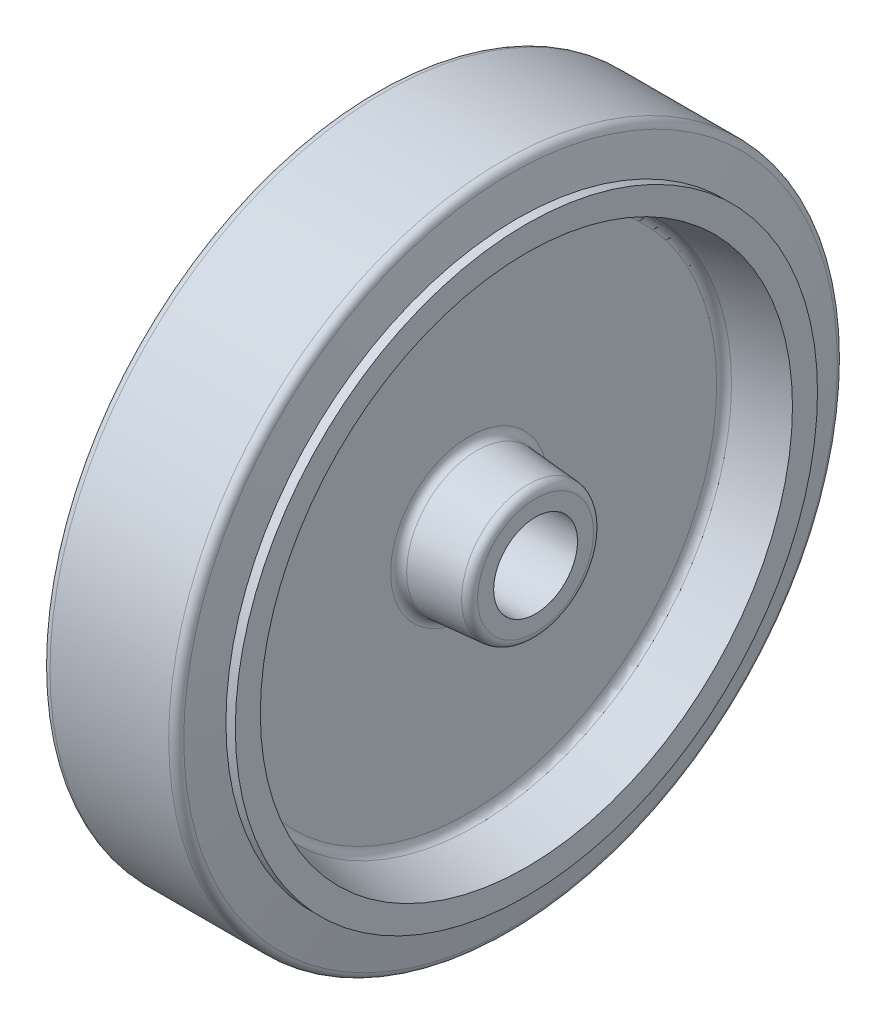
ISO-10303-21;
HEADER;
FILE_DESCRIPTION(('STEP AP214'),'2;1');
FILE_NAME('part.step','',(''),(''),'','','');
FILE_SCHEMA(('AUTOMOTIVE_DESIGN { 1 0 10303 214 1 1 1 1 }'));
ENDSEC;
DATA;
#1=APPLICATION_CONTEXT('core data for automotive mechanical design processes');
#2=APPLICATION_PROTOCOL_DEFINITION('international standard','automotive_design',2000,#1);
#3=PRODUCT_CONTEXT('',#1,'mechanical');
#4=PRODUCT('Part','Part','',(#3));
#5=PRODUCT_RELATED_PRODUCT_CATEGORY('part','',(#4));
#6=PRODUCT_DEFINITION_FORMATION('','',#4);
#7=PRODUCT_DEFINITION_CONTEXT('part definition',#1,'design');
#8=PRODUCT_DEFINITION('design','',#6,#7);
#9=PRODUCT_DEFINITION_SHAPE('','',#8);
#10=(LENGTH_UNIT() NAMED_UNIT(*) SI_UNIT(.MILLI.,.METRE.));
#11=(NAMED_UNIT(*) PLANE_ANGLE_UNIT() SI_UNIT($,.RADIAN.));
#12=(NAMED_UNIT(*) SI_UNIT($,.STERADIAN.) SOLID_ANGLE_UNIT());
#13=UNCERTAINTY_MEASURE_WITH_UNIT(LENGTH_MEASURE(1.E-05),#10,'distance_accuracy_value','');
#14=(GEOMETRIC_REPRESENTATION_CONTEXT(3) GLOBAL_UNCERTAINTY_ASSIGNED_CONTEXT((#13)) GLOBAL_UNIT_ASSIGNED_CONTEXT((#10,
#11,#12)) REPRESENTATION_CONTEXT('',''));
#15=CARTESIAN_POINT('',(0.,0.,0.));
#16=DIRECTION('',(0.,0.,1.));
#17=DIRECTION('',(1.,0.,0.));
#18=AXIS2_PLACEMENT_3D('',#15,#16,#17);
#19=CARTESIAN_POINT('',(15.9,0.,0.));
#20=DIRECTION('',(-1.,0.,0.));
#21=DIRECTION('',(0.,0.,1.));
#22=AXIS2_PLACEMENT_3D('',#19,#20,#21);
#23=CONICAL_SURFACE('',#22,80.,1.39137423336047);
#24=CARTESIAN_POINT('',(16.1980092545903,0.,0.));
#25=DIRECTION('',(1.,0.,0.));
#26=DIRECTION('',(0.,0.,-1.));
#27=AXIS2_PLACEMENT_3D('',#24,#25,#26);
#28=CIRCLE('',#27,78.3569219476642);
#29=CARTESIAN_POINT('',(16.1980092545903,0.,-78.3569219476642));
#30=VERTEX_POINT('',#29);
#31=EDGE_CURVE('E48',#30,#30,#28,.T.);
#32=ORIENTED_EDGE('',*,*,#31,.T.);
#33=EDGE_LOOP('',(#32));
#34=FACE_BOUND('',#33,.T.);
#35=CARTESIAN_POINT('',(17.75,0.,0.));
#36=DIRECTION('',(-1.,0.,0.));
#37=DIRECTION('',(0.,0.,1.));
#38=AXIS2_PLACEMENT_3D('',#35,#36,#37);
#39=CIRCLE('',#38,69.8);
#40=CARTESIAN_POINT('',(17.75,0.,69.8));
#41=VERTEX_POINT('',#40);
#42=EDGE_CURVE('E93',#41,#41,#39,.T.);
#43=ORIENTED_EDGE('',*,*,#42,.T.);
#44=EDGE_LOOP('',(#43));
#45=FACE_BOUND('',#44,.T.);
#46=ADVANCED_FACE('F37',(#34,#45),#23,.T.);
#47=CARTESIAN_POINT('',(0.,0.,0.));
#48=DIRECTION('',(-1.,0.,0.));
#49=DIRECTION('',(0.,0.,1.));
#50=AXIS2_PLACEMENT_3D('',#47,#48,#49);
#51=CYLINDRICAL_SURFACE('',#50,69.8);
#52=CARTESIAN_POINT('',(20.,0.,0.));
#53=DIRECTION('',(-1.,0.,0.));
#54=DIRECTION('',(0.,0.,1.));
#55=AXIS2_PLACEMENT_3D('',#52,#53,#54);
#56=CIRCLE('',#55,69.8);
#57=CARTESIAN_POINT('',(20.,0.,69.8));
#58=VERTEX_POINT('',#57);
#59=EDGE_CURVE('E96',#58,#58,#56,.T.);
#60=ORIENTED_EDGE('',*,*,#59,.T.);
#61=EDGE_LOOP('',(#60));
#62=FACE_BOUND('',#61,.T.);
#63=ORIENTED_EDGE('',*,*,#42,.F.);
#64=EDGE_LOOP('',(#63));
#65=FACE_BOUND('',#64,.T.);
#66=ADVANCED_FACE('F136',(#62,#65),#51,.T.);
#67=CARTESIAN_POINT('',(20.,-69.8,0.));
#68=DIRECTION('',(1.,0.,0.));
#69=DIRECTION('',(0.,0.,-1.));
#70=AXIS2_PLACEMENT_3D('',#67,#68,#69);
#71=PLANE('',#70);
#72=CARTESIAN_POINT('',(20.,0.,0.));
#73=DIRECTION('',(-1.,0.,0.));
#74=DIRECTION('',(0.,0.,1.));
#75=AXIS2_PLACEMENT_3D('',#72,#73,#74);
#76=CIRCLE('',#75,63.8);
#77=CARTESIAN_POINT('',(20.,0.,63.8));
#78=VERTEX_POINT('',#77);
#79=EDGE_CURVE('E99',#78,#78,#76,.T.);
#80=ORIENTED_EDGE('',*,*,#79,.T.);
#81=EDGE_LOOP('',(#80));
#82=FACE_BOUND('',#81,.T.);
#83=ORIENTED_EDGE('',*,*,#59,.F.);
#84=EDGE_LOOP('',(#83));
#85=FACE_BOUND('',#84,.T.);
#86=ADVANCED_FACE('F142',(#82,#85),#71,.T.);
#87=CARTESIAN_POINT('',(20.,0.,0.));
#88=DIRECTION('',(1.,0.,0.));
#89=DIRECTION('',(0.,0.,-1.));
#90=AXIS2_PLACEMENT_3D('',#87,#88,#89);
#91=CONICAL_SURFACE('',#90,63.8,0.205103886501625);
#92=CARTESIAN_POINT('',(7.89266225994667,0.,0.));
#93=DIRECTION('',(1.,0.,0.));
#94=DIRECTION('',(0.,0.,-1.));
#95=AXIS2_PLACEMENT_3D('',#92,#93,#94);
#96=CIRCLE('',#95,61.2813202511568);
#97=CARTESIAN_POINT('',(7.89266225994667,0.,-61.2813202511568));
#98=VERTEX_POINT('',#97);
#99=EDGE_CURVE('E90',#98,#98,#96,.F.);
#100=ORIENTED_EDGE('',*,*,#99,.T.);
#101=EDGE_LOOP('',(#100));
#102=FACE_BOUND('',#101,.T.);
#103=ORIENTED_EDGE('',*,*,#79,.F.);
#104=EDGE_LOOP('',(#103));
#105=FACE_BOUND('',#104,.T.);
#106=ADVANCED_FACE('F192',(#102,#105),#91,.F.);
#107=CARTESIAN_POINT('',(6.3,-60.95,0.));
#108=DIRECTION('',(1.,0.,0.));
#109=DIRECTION('',(0.,0.,-1.));
#110=AXIS2_PLACEMENT_3D('',#107,#108,#109);
#111=PLANE('',#110);
#112=CARTESIAN_POINT('',(6.3,0.,0.));
#113=DIRECTION('',(1.,0.,0.));
#114=DIRECTION('',(0.,0.,-1.));
#115=AXIS2_PLACEMENT_3D('',#112,#113,#114);
#116=CIRCLE('',#115,59.3232405884443);
#117=CARTESIAN_POINT('',(6.3,0.,-59.3232405884443));
#118=VERTEX_POINT('',#117);
#119=EDGE_CURVE('E84',#118,#118,#116,.T.);
#120=ORIENTED_EDGE('',*,*,#119,.T.);
#121=EDGE_LOOP('',(#120));
#122=FACE_BOUND('',#121,.T.);
#123=CARTESIAN_POINT('',(6.3,0.,0.));
#124=DIRECTION('',(1.,0.,0.));
#125=DIRECTION('',(0.,0.,-1.));
#126=AXIS2_PLACEMENT_3D('',#123,#124,#125);
#127=CIRCLE('',#126,18.8489383060883);
#128=CARTESIAN_POINT('',(6.3,0.,-18.8489383060883));
#129=VERTEX_POINT('',#128);
#130=EDGE_CURVE('E87',#129,#129,#127,.F.);
#131=ORIENTED_EDGE('',*,*,#130,.T.);
#132=EDGE_LOOP('',(#131));
#133=FACE_BOUND('',#132,.T.);
#134=ADVANCED_FACE('F183',(#122,#133),#111,.T.);
#135=CARTESIAN_POINT('',(6.3,0.,0.));
#136=DIRECTION('',(-1.,0.,0.));
#137=DIRECTION('',(0.,0.,1.));
#138=AXIS2_PLACEMENT_3D('',#135,#136,#137);
#139=CONICAL_SURFACE('',#138,17.,0.0784549865787729);
#140=CARTESIAN_POINT('',(8.14325094562697,0.,0.));
#141=DIRECTION('',(-1.,0.,0.));
#142=DIRECTION('',(0.,0.,1.));
#143=AXIS2_PLACEMENT_3D('',#140,#141,#142);
#144=CIRCLE('',#143,16.8550903344633);
#145=CARTESIAN_POINT('',(8.14325094562697,0.,16.8550903344633));
#146=VERTEX_POINT('',#145);
#147=EDGE_CURVE('E78',#146,#146,#144,.F.);
#148=ORIENTED_EDGE('',*,*,#147,.T.);
#149=EDGE_LOOP('',(#148));
#150=FACE_BOUND('',#149,.T.);
#151=CARTESIAN_POINT('',(20.356749054373,0.,0.));
#152=DIRECTION('',(1.,0.,0.));
#153=DIRECTION('',(0.,0.,-1.));
#154=AXIS2_PLACEMENT_3D('',#151,#152,#153);
#155=CIRCLE('',#154,15.8949096655367);
#156=CARTESIAN_POINT('',(20.356749054373,0.,-15.8949096655367));
#157=VERTEX_POINT('',#156);
#158=EDGE_CURVE('E81',#157,#157,#155,.F.);
#159=ORIENTED_EDGE('',*,*,#158,.T.);
#160=EDGE_LOOP('',(#159));
#161=FACE_BOUND('',#160,.T.);
#162=ADVANCED_FACE('F180',(#150,#161),#139,.T.);
#163=CARTESIAN_POINT('',(22.2,-15.75,0.));
#164=DIRECTION('',(1.,0.,0.));
#165=DIRECTION('',(0.,0.,-1.));
#166=AXIS2_PLACEMENT_3D('',#163,#164,#165);
#167=PLANE('',#166);
#168=CARTESIAN_POINT('',(22.2,0.,0.));
#169=DIRECTION('',(1.,0.,0.));
#170=DIRECTION('',(0.,0.,-1.));
#171=AXIS2_PLACEMENT_3D('',#168,#169,#170);
#172=CIRCLE('',#171,13.9010616939117);
#173=CARTESIAN_POINT('',(22.2,0.,-13.9010616939117));
#174=VERTEX_POINT('',#173);
#175=EDGE_CURVE('E44',#174,#174,#172,.T.);
#176=ORIENTED_EDGE('',*,*,#175,.T.);
#177=EDGE_LOOP('',(#176));
#178=FACE_BOUND('',#177,.T.);
#179=CARTESIAN_POINT('',(22.2,0.,0.));
#180=DIRECTION('',(-1.,0.,0.));
#181=DIRECTION('',(0.,0.,1.));
#182=AXIS2_PLACEMENT_3D('',#179,#180,#181);
#183=CIRCLE('',#182,10.05);
#184=CARTESIAN_POINT('',(22.2,0.,10.05));
#185=VERTEX_POINT('',#184);
#186=EDGE_CURVE('E102',#185,#185,#183,.T.);
#187=ORIENTED_EDGE('',*,*,#186,.T.);
#188=EDGE_LOOP('',(#187));
#189=FACE_BOUND('',#188,.T.);
#190=ADVANCED_FACE('F182',(#178,#189),#167,.T.);
#191=CARTESIAN_POINT('',(0.,0.,0.));
#192=DIRECTION('',(-1.,0.,0.));
#193=DIRECTION('',(0.,0.,1.));
#194=AXIS2_PLACEMENT_3D('',#191,#192,#193);
#195=CYLINDRICAL_SURFACE('',#194,10.05);
#196=CARTESIAN_POINT('',(-22.2,0.,0.));
#197=DIRECTION('',(-1.,0.,0.));
#198=DIRECTION('',(0.,0.,1.));
#199=AXIS2_PLACEMENT_3D('',#196,#197,#198);
#200=CIRCLE('',#199,10.05);
#201=CARTESIAN_POINT('',(-22.2,0.,10.05));
#202=VERTEX_POINT('',#201);
#203=EDGE_CURVE('E105',#202,#202,#200,.T.);
#204=ORIENTED_EDGE('',*,*,#203,.T.);
#205=EDGE_LOOP('',(#204));
#206=FACE_BOUND('',#205,.T.);
#207=ORIENTED_EDGE('',*,*,#186,.F.);
#208=EDGE_LOOP('',(#207));
#209=FACE_BOUND('',#208,.T.);
#210=ADVANCED_FACE('F190',(#206,#209),#195,.F.);
#211=CARTESIAN_POINT('',(-22.2,-15.75,0.));
#212=DIRECTION('',(-1.,0.,0.));
#213=DIRECTION('',(0.,0.,1.));
#214=AXIS2_PLACEMENT_3D('',#211,#212,#213);
#215=PLANE('',#214);
#216=CARTESIAN_POINT('',(-22.2,0.,0.));
#217=DIRECTION('',(-1.,0.,0.));
#218=DIRECTION('',(0.,0.,1.));
#219=AXIS2_PLACEMENT_3D('',#216,#217,#218);
#220=CIRCLE('',#219,13.9010616939117);
#221=CARTESIAN_POINT('',(-22.2,0.,13.9010616939117));
#222=VERTEX_POINT('',#221);
#223=EDGE_CURVE('E10',#222,#222,#220,.T.);
#224=ORIENTED_EDGE('',*,*,#223,.T.);
#225=EDGE_LOOP('',(#224));
#226=FACE_BOUND('',#225,.T.);
#227=ORIENTED_EDGE('',*,*,#203,.F.);
#228=EDGE_LOOP('',(#227));
#229=FACE_BOUND('',#228,.T.);
#230=ADVANCED_FACE('F237',(#226,#229),#215,.T.);
#231=CARTESIAN_POINT('',(-22.2,0.,0.));
#232=DIRECTION('',(1.,0.,0.));
#233=DIRECTION('',(0.,0.,-1.));
#234=AXIS2_PLACEMENT_3D('',#231,#232,#233);
#235=CONICAL_SURFACE('',#234,15.75,0.0784549865787729);
#236=CARTESIAN_POINT('',(-8.14325094562697,0.,0.));
#237=DIRECTION('',(1.,0.,0.));
#238=DIRECTION('',(0.,0.,-1.));
#239=AXIS2_PLACEMENT_3D('',#236,#237,#238);
#240=CIRCLE('',#239,16.8550903344633);
#241=CARTESIAN_POINT('',(-8.14325094562697,0.,-16.8550903344633));
#242=VERTEX_POINT('',#241);
#243=EDGE_CURVE('E72',#242,#242,#240,.F.);
#244=ORIENTED_EDGE('',*,*,#243,.T.);
#245=EDGE_LOOP('',(#244));
#246=FACE_BOUND('',#245,.T.);
#247=CARTESIAN_POINT('',(-20.356749054373,0.,0.));
#248=DIRECTION('',(-1.,0.,0.));
#249=DIRECTION('',(0.,0.,1.));
#250=AXIS2_PLACEMENT_3D('',#247,#248,#249);
#251=CIRCLE('',#250,15.8949096655367);
#252=CARTESIAN_POINT('',(-20.356749054373,0.,15.8949096655367));
#253=VERTEX_POINT('',#252);
#254=EDGE_CURVE('E75',#253,#253,#251,.F.);
#255=ORIENTED_EDGE('',*,*,#254,.T.);
#256=EDGE_LOOP('',(#255));
#257=FACE_BOUND('',#256,.T.);
#258=ADVANCED_FACE('F241',(#246,#257),#235,.T.);
#259=CARTESIAN_POINT('',(-6.3,-60.95,0.));
#260=DIRECTION('',(-1.,0.,0.));
#261=DIRECTION('',(0.,0.,1.));
#262=AXIS2_PLACEMENT_3D('',#259,#260,#261);
#263=PLANE('',#262);
#264=CARTESIAN_POINT('',(-6.3,0.,0.));
#265=DIRECTION('',(-1.,0.,0.));
#266=DIRECTION('',(0.,0.,1.));
#267=AXIS2_PLACEMENT_3D('',#264,#265,#266);
#268=CIRCLE('',#267,18.8489383060883);
#269=CARTESIAN_POINT('',(-6.3,0.,18.8489383060883));
#270=VERTEX_POINT('',#269);
#271=EDGE_CURVE('E66',#270,#270,#268,.F.);
#272=ORIENTED_EDGE('',*,*,#271,.T.);
#273=EDGE_LOOP('',(#272));
#274=FACE_BOUND('',#273,.T.);
#275=CARTESIAN_POINT('',(-6.3,0.,0.));
#276=DIRECTION('',(-1.,0.,0.));
#277=DIRECTION('',(0.,0.,1.));
#278=AXIS2_PLACEMENT_3D('',#275,#276,#277);
#279=CIRCLE('',#278,59.3232405884443);
#280=CARTESIAN_POINT('',(-6.3,0.,59.3232405884443));
#281=VERTEX_POINT('',#280);
#282=EDGE_CURVE('E69',#281,#281,#279,.T.);
#283=ORIENTED_EDGE('',*,*,#282,.T.);
#284=EDGE_LOOP('',(#283));
#285=FACE_BOUND('',#284,.T.);
#286=ADVANCED_FACE('F250',(#274,#285),#263,.T.);
#287=CARTESIAN_POINT('',(-6.3,0.,0.));
#288=DIRECTION('',(-1.,0.,0.));
#289=DIRECTION('',(0.,0.,1.));
#290=AXIS2_PLACEMENT_3D('',#287,#288,#289);
#291=CONICAL_SURFACE('',#290,60.95,0.205103886501625);
#292=CARTESIAN_POINT('',(-7.89266225994667,0.,0.));
#293=DIRECTION('',(-1.,0.,0.));
#294=DIRECTION('',(0.,0.,1.));
#295=AXIS2_PLACEMENT_3D('',#292,#293,#294);
#296=CIRCLE('',#295,61.2813202511568);
#297=CARTESIAN_POINT('',(-7.89266225994667,0.,61.2813202511568));
#298=VERTEX_POINT('',#297);
#299=EDGE_CURVE('E63',#298,#298,#296,.F.);
#300=ORIENTED_EDGE('',*,*,#299,.T.);
#301=EDGE_LOOP('',(#300));
#302=FACE_BOUND('',#301,.T.);
#303=CARTESIAN_POINT('',(-20.,0.,0.));
#304=DIRECTION('',(-1.,0.,0.));
#305=DIRECTION('',(0.,0.,1.));
#306=AXIS2_PLACEMENT_3D('',#303,#304,#305);
#307=CIRCLE('',#306,63.8);
#308=CARTESIAN_POINT('',(-20.,0.,63.8));
#309=VERTEX_POINT('',#308);
#310=EDGE_CURVE('E108',#309,#309,#307,.T.);
#311=ORIENTED_EDGE('',*,*,#310,.T.);
#312=EDGE_LOOP('',(#311));
#313=FACE_BOUND('',#312,.T.);
#314=ADVANCED_FACE('F260',(#302,#313),#291,.F.);
#315=CARTESIAN_POINT('',(-20.,-69.8,0.));
#316=DIRECTION('',(-1.,0.,0.));
#317=DIRECTION('',(0.,0.,1.));
#318=AXIS2_PLACEMENT_3D('',#315,#316,#317);
#319=PLANE('',#318);
#320=CARTESIAN_POINT('',(-20.,0.,0.));
#321=DIRECTION('',(-1.,0.,0.));
#322=DIRECTION('',(0.,0.,1.));
#323=AXIS2_PLACEMENT_3D('',#320,#321,#322);
#324=CIRCLE('',#323,69.8);
#325=CARTESIAN_POINT('',(-20.,0.,69.8));
#326=VERTEX_POINT('',#325);
#327=EDGE_CURVE('E111',#326,#326,#324,.T.);
#328=ORIENTED_EDGE('',*,*,#327,.T.);
#329=EDGE_LOOP('',(#328));
#330=FACE_BOUND('',#329,.T.);
#331=ORIENTED_EDGE('',*,*,#310,.F.);
#332=EDGE_LOOP('',(#331));
#333=FACE_BOUND('',#332,.T.);
#334=ADVANCED_FACE('F133',(#330,#333),#319,.T.);
#335=CARTESIAN_POINT('',(0.,0.,0.));
#336=DIRECTION('',(-1.,0.,0.));
#337=DIRECTION('',(0.,0.,1.));
#338=AXIS2_PLACEMENT_3D('',#335,#336,#337);
#339=CYLINDRICAL_SURFACE('',#338,69.8);
#340=CARTESIAN_POINT('',(-17.75,0.,0.));
#341=DIRECTION('',(-1.,0.,0.));
#342=DIRECTION('',(0.,0.,1.));
#343=AXIS2_PLACEMENT_3D('',#340,#341,#342);
#344=CIRCLE('',#343,69.8);
#345=CARTESIAN_POINT('',(-17.75,0.,69.8));
#346=VERTEX_POINT('',#345);
#347=EDGE_CURVE('E114',#346,#346,#344,.T.);
#348=ORIENTED_EDGE('',*,*,#347,.T.);
#349=EDGE_LOOP('',(#348));
#350=FACE_BOUND('',#349,.T.);
#351=ORIENTED_EDGE('',*,*,#327,.F.);
#352=EDGE_LOOP('',(#351));
#353=FACE_BOUND('',#352,.T.);
#354=ADVANCED_FACE('F118',(#350,#353),#339,.T.);
#355=CARTESIAN_POINT('',(-17.75,0.,0.));
#356=DIRECTION('',(1.,0.,0.));
#357=DIRECTION('',(0.,0.,-1.));
#358=AXIS2_PLACEMENT_3D('',#355,#356,#357);
#359=CONICAL_SURFACE('',#358,69.8,1.39137423336047);
#360=CARTESIAN_POINT('',(-16.1980092545903,0.,0.));
#361=DIRECTION('',(-1.,0.,0.));
#362=DIRECTION('',(0.,0.,1.));
#363=AXIS2_PLACEMENT_3D('',#360,#361,#362);
#364=CIRCLE('',#363,78.3569219476642);
#365=CARTESIAN_POINT('',(-16.1980092545903,0.,78.3569219476642));
#366=VERTEX_POINT('',#365);
#367=EDGE_CURVE('E60',#366,#366,#364,.T.);
#368=ORIENTED_EDGE('',*,*,#367,.T.);
#369=EDGE_LOOP('',(#368));
#370=FACE_BOUND('',#369,.T.);
#371=ORIENTED_EDGE('',*,*,#347,.F.);
#372=EDGE_LOOP('',(#371));
#373=FACE_BOUND('',#372,.T.);
#374=ADVANCED_FACE('F121',(#370,#373),#359,.T.);
#375=CARTESIAN_POINT('',(0.,0.,0.));
#376=DIRECTION('',(-1.,0.,0.));
#377=DIRECTION('',(0.,0.,1.));
#378=AXIS2_PLACEMENT_3D('',#375,#376,#377);
#379=CYLINDRICAL_SURFACE('',#378,80.);
#380=CARTESIAN_POINT('',(-14.2301152728739,0.,0.));
#381=DIRECTION('',(1.,0.,0.));
#382=DIRECTION('',(0.,0.,-1.));
#383=AXIS2_PLACEMENT_3D('',#380,#381,#382);
#384=CIRCLE('',#383,80.);
#385=CARTESIAN_POINT('',(-14.2301152728739,0.,-80.));
#386=VERTEX_POINT('',#385);
#387=EDGE_CURVE('E52',#386,#386,#384,.T.);
#388=ORIENTED_EDGE('',*,*,#387,.T.);
#389=EDGE_LOOP('',(#388));
#390=FACE_BOUND('',#389,.T.);
#391=CARTESIAN_POINT('',(14.2301152728739,0.,0.));
#392=DIRECTION('',(1.,0.,0.));
#393=DIRECTION('',(0.,0.,-1.));
#394=AXIS2_PLACEMENT_3D('',#391,#392,#393);
#395=CIRCLE('',#394,80.);
#396=CARTESIAN_POINT('',(14.2301152728739,0.,-80.));
#397=VERTEX_POINT('',#396);
#398=EDGE_CURVE('E57',#397,#397,#395,.F.);
#399=ORIENTED_EDGE('',*,*,#398,.T.);
#400=EDGE_LOOP('',(#399));
#401=FACE_BOUND('',#400,.T.);
#402=ADVANCED_FACE('F123',(#390,#401),#379,.T.);
#403=CARTESIAN_POINT('',(8.3,0.,0.));
#404=DIRECTION('',(1.,0.,0.));
#405=DIRECTION('',(0.,0.,-1.));
#406=AXIS2_PLACEMENT_3D('',#403,#404,#405);
#407=TOROIDAL_SURFACE('',#406,59.3232405884443,2.);
#408=ORIENTED_EDGE('',*,*,#119,.F.);
#409=EDGE_LOOP('',(#408));
#410=FACE_BOUND('',#409,.T.);
#411=ORIENTED_EDGE('',*,*,#99,.F.);
#412=EDGE_LOOP('',(#411));
#413=FACE_BOUND('',#412,.T.);
#414=ADVANCED_FACE('F130',(#410,#413),#407,.F.);
#415=CARTESIAN_POINT('',(8.3,0.,0.));
#416=DIRECTION('',(1.,0.,0.));
#417=DIRECTION('',(0.,0.,-1.));
#418=AXIS2_PLACEMENT_3D('',#415,#416,#417);
#419=TOROIDAL_SURFACE('',#418,18.8489383060883,2.);
#420=ORIENTED_EDGE('',*,*,#147,.F.);
#421=EDGE_LOOP('',(#420));
#422=FACE_BOUND('',#421,.T.);
#423=ORIENTED_EDGE('',*,*,#130,.F.);
#424=EDGE_LOOP('',(#423));
#425=FACE_BOUND('',#424,.T.);
#426=ADVANCED_FACE('F150',(#422,#425),#419,.F.);
#427=CARTESIAN_POINT('',(-8.3,0.,0.));
#428=DIRECTION('',(-1.,0.,0.));
#429=DIRECTION('',(0.,0.,1.));
#430=AXIS2_PLACEMENT_3D('',#427,#428,#429);
#431=TOROIDAL_SURFACE('',#430,18.8489383060883,2.);
#432=ORIENTED_EDGE('',*,*,#271,.F.);
#433=EDGE_LOOP('',(#432));
#434=FACE_BOUND('',#433,.T.);
#435=ORIENTED_EDGE('',*,*,#243,.F.);
#436=EDGE_LOOP('',(#435));
#437=FACE_BOUND('',#436,.T.);
#438=ADVANCED_FACE('F154',(#434,#437),#431,.F.);
#439=CARTESIAN_POINT('',(-8.3,0.,0.));
#440=DIRECTION('',(-1.,0.,0.));
#441=DIRECTION('',(0.,0.,1.));
#442=AXIS2_PLACEMENT_3D('',#439,#440,#441);
#443=TOROIDAL_SURFACE('',#442,59.3232405884443,2.);
#444=ORIENTED_EDGE('',*,*,#299,.F.);
#445=EDGE_LOOP('',(#444));
#446=FACE_BOUND('',#445,.T.);
#447=ORIENTED_EDGE('',*,*,#282,.F.);
#448=EDGE_LOOP('',(#447));
#449=FACE_BOUND('',#448,.T.);
#450=ADVANCED_FACE('F158',(#446,#449),#443,.F.);
#451=CARTESIAN_POINT('',(-14.2301152728739,0.,0.));
#452=DIRECTION('',(1.,0.,0.));
#453=DIRECTION('',(0.,0.,-1.));
#454=AXIS2_PLACEMENT_3D('',#451,#452,#453);
#455=TOROIDAL_SURFACE('',#454,78.,2.);
#456=ORIENTED_EDGE('',*,*,#387,.F.);
#457=EDGE_LOOP('',(#456));
#458=FACE_BOUND('',#457,.T.);
#459=ORIENTED_EDGE('',*,*,#367,.F.);
#460=EDGE_LOOP('',(#459));
#461=FACE_BOUND('',#460,.T.);
#462=ADVANCED_FACE('F162',(#458,#461),#455,.T.);
#463=CARTESIAN_POINT('',(14.2301152728739,0.,0.));
#464=DIRECTION('',(1.,0.,0.));
#465=DIRECTION('',(0.,0.,-1.));
#466=AXIS2_PLACEMENT_3D('',#463,#464,#465);
#467=TOROIDAL_SURFACE('',#466,78.,2.);
#468=ORIENTED_EDGE('',*,*,#31,.F.);
#469=EDGE_LOOP('',(#468));
#470=FACE_BOUND('',#469,.T.);
#471=ORIENTED_EDGE('',*,*,#398,.F.);
#472=EDGE_LOOP('',(#471));
#473=FACE_BOUND('',#472,.T.);
#474=ADVANCED_FACE('F166',(#470,#473),#467,.T.);
#475=CARTESIAN_POINT('',(20.2,0.,0.));
#476=DIRECTION('',(1.,0.,0.));
#477=DIRECTION('',(0.,0.,-1.));
#478=AXIS2_PLACEMENT_3D('',#475,#476,#477);
#479=TOROIDAL_SURFACE('',#478,13.9010616939117,2.);
#480=ORIENTED_EDGE('',*,*,#175,.F.);
#481=EDGE_LOOP('',(#480));
#482=FACE_BOUND('',#481,.T.);
#483=ORIENTED_EDGE('',*,*,#158,.F.);
#484=EDGE_LOOP('',(#483));
#485=FACE_BOUND('',#484,.T.);
#486=ADVANCED_FACE('F169',(#482,#485),#479,.T.);
#487=CARTESIAN_POINT('',(-20.2,0.,0.));
#488=DIRECTION('',(-1.,0.,0.));
#489=DIRECTION('',(0.,0.,1.));
#490=AXIS2_PLACEMENT_3D('',#487,#488,#489);
#491=TOROIDAL_SURFACE('',#490,13.9010616939117,2.);
#492=ORIENTED_EDGE('',*,*,#254,.F.);
#493=EDGE_LOOP('',(#492));
#494=FACE_BOUND('',#493,.T.);
#495=ORIENTED_EDGE('',*,*,#223,.F.);
#496=EDGE_LOOP('',(#495));
#497=FACE_BOUND('',#496,.T.);
#498=ADVANCED_FACE('F39',(#494,#497),#491,.T.);
#499=CLOSED_SHELL('',(#46,#66,#86,#106,#134,#162,#190,#210,#230,#258,#286,#314,#334,#354,#374,
#402,#414,#426,#438,#450,#462,#474,#486,#498));
#500=MANIFOLD_SOLID_BREP('B2',#499);
#501=ADVANCED_BREP_SHAPE_REPRESENTATION('',(#18,#500),#14);
#502=SHAPE_DEFINITION_REPRESENTATION(#9,#501);
ENDSEC;
END-ISO-10303-21;
